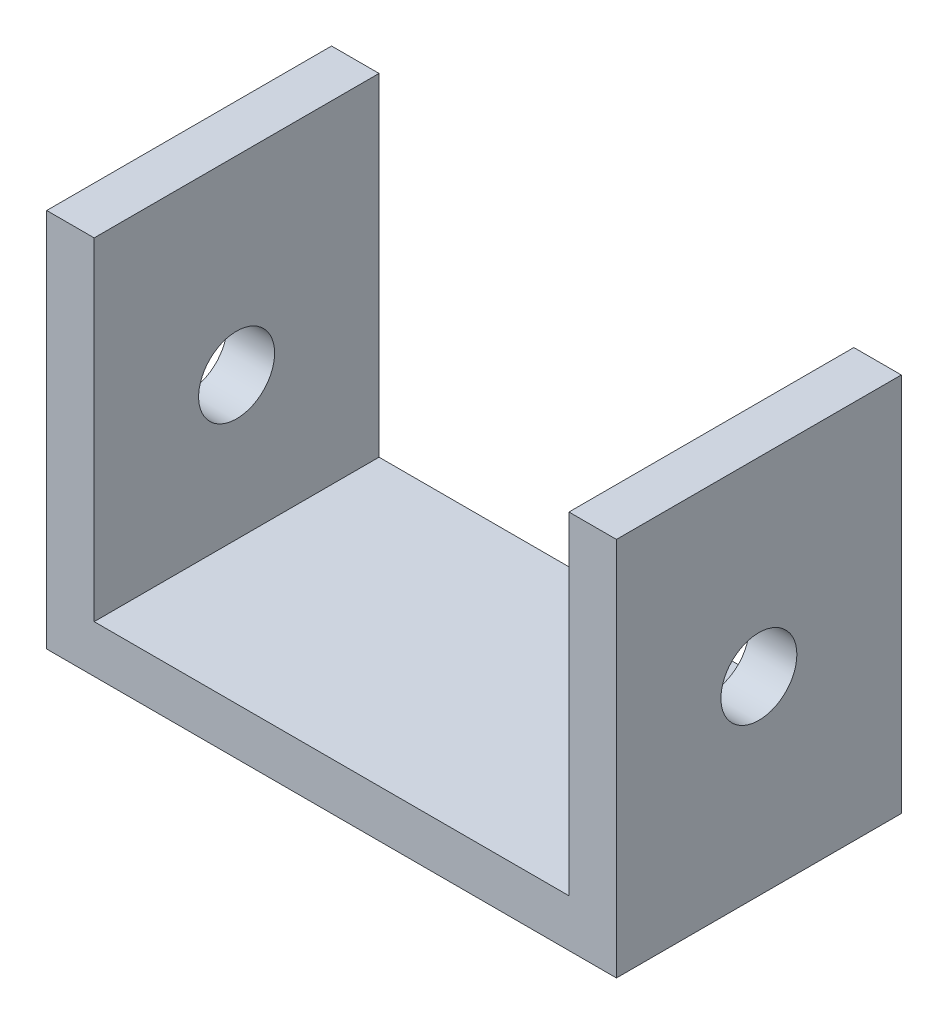
ISO-10303-21;
HEADER;
FILE_DESCRIPTION(('STEP AP214'),'2;1');
FILE_NAME('part.step','',(''),(''),'','','');
FILE_SCHEMA(('AUTOMOTIVE_DESIGN { 1 0 10303 214 1 1 1 1 }'));
ENDSEC;
DATA;
#1=APPLICATION_CONTEXT('core data for automotive mechanical design processes');
#2=APPLICATION_PROTOCOL_DEFINITION('international standard','automotive_design',2000,#1);
#3=PRODUCT_CONTEXT('',#1,'mechanical');
#4=PRODUCT('Part','Part','',(#3));
#5=PRODUCT_RELATED_PRODUCT_CATEGORY('part','',(#4));
#6=PRODUCT_DEFINITION_FORMATION('','',#4);
#7=PRODUCT_DEFINITION_CONTEXT('part definition',#1,'design');
#8=PRODUCT_DEFINITION('design','',#6,#7);
#9=PRODUCT_DEFINITION_SHAPE('','',#8);
#10=(LENGTH_UNIT() NAMED_UNIT(*) SI_UNIT(.MILLI.,.METRE.));
#11=(NAMED_UNIT(*) PLANE_ANGLE_UNIT() SI_UNIT($,.RADIAN.));
#12=(NAMED_UNIT(*) SI_UNIT($,.STERADIAN.) SOLID_ANGLE_UNIT());
#13=UNCERTAINTY_MEASURE_WITH_UNIT(LENGTH_MEASURE(1.E-05),#10,'distance_accuracy_value','');
#14=(GEOMETRIC_REPRESENTATION_CONTEXT(3) GLOBAL_UNCERTAINTY_ASSIGNED_CONTEXT((#13)) GLOBAL_UNIT_ASSIGNED_CONTEXT((#10,
#11,#12)) REPRESENTATION_CONTEXT('',''));
#15=CARTESIAN_POINT('',(0.,0.,0.));
#16=DIRECTION('',(0.,0.,1.));
#17=DIRECTION('',(1.,0.,0.));
#18=AXIS2_PLACEMENT_3D('',#15,#16,#17);
#19=CARTESIAN_POINT('',(0.,10.,0.));
#20=DIRECTION('',(0.,1.,0.));
#21=DIRECTION('',(0.,0.,1.));
#22=AXIS2_PLACEMENT_3D('',#19,#20,#21);
#23=PLANE('',#22);
#24=DIRECTION('',(-1.,0.,0.));
#25=VECTOR('',#24,1.);
#26=CARTESIAN_POINT('',(-60.,10.,-30.));
#27=LINE('',#26,#25);
#28=CARTESIAN_POINT('',(50.,10.,-30.));
#29=VERTEX_POINT('',#28);
#30=CARTESIAN_POINT('',(-50.,10.,-30.));
#31=VERTEX_POINT('',#30);
#32=EDGE_CURVE('E167',#29,#31,#27,.T.);
#33=ORIENTED_EDGE('',*,*,#32,.T.);
#34=DIRECTION('',(0.,0.,1.));
#35=VECTOR('',#34,1.);
#36=CARTESIAN_POINT('',(-50.,10.,30.));
#37=LINE('',#36,#35);
#38=CARTESIAN_POINT('',(-50.,10.,30.));
#39=VERTEX_POINT('',#38);
#40=EDGE_CURVE('E128',#31,#39,#37,.T.);
#41=ORIENTED_EDGE('',*,*,#40,.T.);
#42=DIRECTION('',(1.,0.,0.));
#43=VECTOR('',#42,1.);
#44=CARTESIAN_POINT('',(-60.,10.,30.));
#45=LINE('',#44,#43);
#46=CARTESIAN_POINT('',(50.,10.,30.));
#47=VERTEX_POINT('',#46);
#48=EDGE_CURVE('E169',#39,#47,#45,.T.);
#49=ORIENTED_EDGE('',*,*,#48,.T.);
#50=DIRECTION('',(0.,0.,1.));
#51=VECTOR('',#50,1.);
#52=CARTESIAN_POINT('',(50.,10.,30.));
#53=LINE('',#52,#51);
#54=EDGE_CURVE('E62',#29,#47,#53,.T.);
#55=ORIENTED_EDGE('',*,*,#54,.F.);
#56=EDGE_LOOP('',(#33,#41,#49,#55));
#57=FACE_BOUND('',#56,.T.);
#58=ADVANCED_FACE('F41',(#57),#23,.T.);
#59=CARTESIAN_POINT('',(60.,10.,-30.));
#60=DIRECTION('',(-1.,0.,0.));
#61=DIRECTION('',(0.,0.,1.));
#62=AXIS2_PLACEMENT_3D('',#59,#60,#61);
#63=PLANE('',#62);
#64=CARTESIAN_POINT('',(60.,40.,0.));
#65=DIRECTION('',(1.,0.,0.));
#66=DIRECTION('',(0.,0.,-1.));
#67=AXIS2_PLACEMENT_3D('',#64,#65,#66);
#68=CIRCLE('',#67,8.);
#69=CARTESIAN_POINT('',(60.,40.,-8.00000000000001));
#70=VERTEX_POINT('',#69);
#71=EDGE_CURVE('E141',#70,#70,#68,.T.);
#72=ORIENTED_EDGE('',*,*,#71,.F.);
#73=EDGE_LOOP('',(#72));
#74=FACE_BOUND('',#73,.T.);
#75=DIRECTION('',(0.,-1.,0.));
#76=VECTOR('',#75,1.);
#77=CARTESIAN_POINT('',(60.,10.,30.));
#78=LINE('',#77,#76);
#79=CARTESIAN_POINT('',(60.,80.,30.));
#80=VERTEX_POINT('',#79);
#81=CARTESIAN_POINT('',(60.,0.,30.));
#82=VERTEX_POINT('',#81);
#83=EDGE_CURVE('E173',#80,#82,#78,.T.);
#84=ORIENTED_EDGE('',*,*,#83,.T.);
#85=DIRECTION('',(0.,0.,-1.));
#86=VECTOR('',#85,1.);
#87=CARTESIAN_POINT('',(60.,0.,-30.));
#88=LINE('',#87,#86);
#89=CARTESIAN_POINT('',(60.,0.,-30.));
#90=VERTEX_POINT('',#89);
#91=EDGE_CURVE('E164',#82,#90,#88,.T.);
#92=ORIENTED_EDGE('',*,*,#91,.T.);
#93=DIRECTION('',(0.,-1.,0.));
#94=VECTOR('',#93,1.);
#95=CARTESIAN_POINT('',(60.,10.,-30.));
#96=LINE('',#95,#94);
#97=CARTESIAN_POINT('',(60.,80.,-30.));
#98=VERTEX_POINT('',#97);
#99=EDGE_CURVE('E11',#98,#90,#96,.T.);
#100=ORIENTED_EDGE('',*,*,#99,.F.);
#101=DIRECTION('',(0.,0.,-1.));
#102=VECTOR('',#101,1.);
#103=CARTESIAN_POINT('',(60.,80.,30.));
#104=LINE('',#103,#102);
#105=EDGE_CURVE('E146',#80,#98,#104,.T.);
#106=ORIENTED_EDGE('',*,*,#105,.F.);
#107=EDGE_LOOP('',(#84,#92,#100,#106));
#108=FACE_BOUND('',#107,.T.);
#109=ADVANCED_FACE('F43',(#74,#108),#63,.F.);
#110=CARTESIAN_POINT('',(-60.,10.,-30.));
#111=DIRECTION('',(0.,0.,1.));
#112=DIRECTION('',(1.,0.,0.));
#113=AXIS2_PLACEMENT_3D('',#110,#111,#112);
#114=PLANE('',#113);
#115=ORIENTED_EDGE('',*,*,#99,.T.);
#116=DIRECTION('',(-1.,0.,0.));
#117=VECTOR('',#116,1.);
#118=CARTESIAN_POINT('',(-60.,0.,-30.));
#119=LINE('',#118,#117);
#120=CARTESIAN_POINT('',(-60.,0.,-30.));
#121=VERTEX_POINT('',#120);
#122=EDGE_CURVE('E115',#90,#121,#119,.T.);
#123=ORIENTED_EDGE('',*,*,#122,.T.);
#124=DIRECTION('',(0.,-1.,0.));
#125=VECTOR('',#124,1.);
#126=CARTESIAN_POINT('',(-60.,10.,-30.));
#127=LINE('',#126,#125);
#128=CARTESIAN_POINT('',(-60.,80.,-30.));
#129=VERTEX_POINT('',#128);
#130=EDGE_CURVE('E49',#129,#121,#127,.T.);
#131=ORIENTED_EDGE('',*,*,#130,.F.);
#132=DIRECTION('',(1.,0.,0.));
#133=VECTOR('',#132,1.);
#134=CARTESIAN_POINT('',(-50.,80.,-30.));
#135=LINE('',#134,#133);
#136=CARTESIAN_POINT('',(-50.,80.,-30.));
#137=VERTEX_POINT('',#136);
#138=EDGE_CURVE('E109',#129,#137,#135,.T.);
#139=ORIENTED_EDGE('',*,*,#138,.T.);
#140=DIRECTION('',(0.,-1.,0.));
#141=VECTOR('',#140,1.);
#142=CARTESIAN_POINT('',(-50.,80.,-30.));
#143=LINE('',#142,#141);
#144=EDGE_CURVE('E143',#137,#31,#143,.T.);
#145=ORIENTED_EDGE('',*,*,#144,.T.);
#146=ORIENTED_EDGE('',*,*,#32,.F.);
#147=DIRECTION('',(0.,-1.,0.));
#148=VECTOR('',#147,1.);
#149=CARTESIAN_POINT('',(50.,80.,-30.));
#150=LINE('',#149,#148);
#151=CARTESIAN_POINT('',(50.,80.,-30.));
#152=VERTEX_POINT('',#151);
#153=EDGE_CURVE('E165',#152,#29,#150,.T.);
#154=ORIENTED_EDGE('',*,*,#153,.F.);
#155=DIRECTION('',(-1.,0.,0.));
#156=VECTOR('',#155,1.);
#157=CARTESIAN_POINT('',(50.,80.,-30.));
#158=LINE('',#157,#156);
#159=EDGE_CURVE('E151',#98,#152,#158,.T.);
#160=ORIENTED_EDGE('',*,*,#159,.F.);
#161=EDGE_LOOP('',(#115,#123,#131,#139,#145,#146,#154,#160));
#162=FACE_BOUND('',#161,.T.);
#163=ADVANCED_FACE('F107',(#162),#114,.F.);
#164=CARTESIAN_POINT('',(-60.,10.,-30.));
#165=DIRECTION('',(1.,0.,0.));
#166=DIRECTION('',(0.,0.,-1.));
#167=AXIS2_PLACEMENT_3D('',#164,#165,#166);
#168=PLANE('',#167);
#169=DIRECTION('',(0.,0.,1.));
#170=VECTOR('',#169,1.);
#171=CARTESIAN_POINT('',(-60.,0.,-30.));
#172=LINE('',#171,#170);
#173=CARTESIAN_POINT('',(-60.,0.,30.));
#174=VERTEX_POINT('',#173);
#175=EDGE_CURVE('E172',#121,#174,#172,.T.);
#176=ORIENTED_EDGE('',*,*,#175,.T.);
#177=DIRECTION('',(0.,-1.,0.));
#178=VECTOR('',#177,1.);
#179=CARTESIAN_POINT('',(-60.,10.,30.));
#180=LINE('',#179,#178);
#181=CARTESIAN_POINT('',(-60.,80.,30.));
#182=VERTEX_POINT('',#181);
#183=EDGE_CURVE('E118',#182,#174,#180,.T.);
#184=ORIENTED_EDGE('',*,*,#183,.F.);
#185=DIRECTION('',(0.,0.,-1.));
#186=VECTOR('',#185,1.);
#187=CARTESIAN_POINT('',(-60.,80.,30.));
#188=LINE('',#187,#186);
#189=EDGE_CURVE('E125',#182,#129,#188,.T.);
#190=ORIENTED_EDGE('',*,*,#189,.T.);
#191=ORIENTED_EDGE('',*,*,#130,.T.);
#192=EDGE_LOOP('',(#176,#184,#190,#191));
#193=FACE_BOUND('',#192,.T.);
#194=CARTESIAN_POINT('',(-60.,40.,0.));
#195=DIRECTION('',(1.,0.,0.));
#196=DIRECTION('',(0.,0.,-1.));
#197=AXIS2_PLACEMENT_3D('',#194,#195,#196);
#198=CIRCLE('',#197,8.);
#199=CARTESIAN_POINT('',(-60.,40.,-8.00000000000001));
#200=VERTEX_POINT('',#199);
#201=EDGE_CURVE('E132',#200,#200,#198,.T.);
#202=ORIENTED_EDGE('',*,*,#201,.T.);
#203=EDGE_LOOP('',(#202));
#204=FACE_BOUND('',#203,.T.);
#205=ADVANCED_FACE('F127',(#193,#204),#168,.F.);
#206=CARTESIAN_POINT('',(-60.,10.,30.));
#207=DIRECTION('',(0.,0.,-1.));
#208=DIRECTION('',(-1.,0.,0.));
#209=AXIS2_PLACEMENT_3D('',#206,#207,#208);
#210=PLANE('',#209);
#211=DIRECTION('',(0.,-1.,0.));
#212=VECTOR('',#211,1.);
#213=CARTESIAN_POINT('',(50.,80.,30.));
#214=LINE('',#213,#212);
#215=CARTESIAN_POINT('',(50.,80.,30.));
#216=VERTEX_POINT('',#215);
#217=EDGE_CURVE('E158',#216,#47,#214,.T.);
#218=ORIENTED_EDGE('',*,*,#217,.T.);
#219=ORIENTED_EDGE('',*,*,#48,.F.);
#220=DIRECTION('',(0.,-1.,0.));
#221=VECTOR('',#220,1.);
#222=CARTESIAN_POINT('',(-50.,80.,30.));
#223=LINE('',#222,#221);
#224=CARTESIAN_POINT('',(-50.,80.,30.));
#225=VERTEX_POINT('',#224);
#226=EDGE_CURVE('E60',#225,#39,#223,.T.);
#227=ORIENTED_EDGE('',*,*,#226,.F.);
#228=DIRECTION('',(-1.,0.,0.));
#229=VECTOR('',#228,1.);
#230=CARTESIAN_POINT('',(-50.,80.,30.));
#231=LINE('',#230,#229);
#232=EDGE_CURVE('E136',#225,#182,#231,.T.);
#233=ORIENTED_EDGE('',*,*,#232,.T.);
#234=ORIENTED_EDGE('',*,*,#183,.T.);
#235=DIRECTION('',(1.,0.,0.));
#236=VECTOR('',#235,1.);
#237=CARTESIAN_POINT('',(-60.,0.,30.));
#238=LINE('',#237,#236);
#239=EDGE_CURVE('E166',#174,#82,#238,.T.);
#240=ORIENTED_EDGE('',*,*,#239,.T.);
#241=ORIENTED_EDGE('',*,*,#83,.F.);
#242=DIRECTION('',(1.,0.,0.));
#243=VECTOR('',#242,1.);
#244=CARTESIAN_POINT('',(50.,80.,30.));
#245=LINE('',#244,#243);
#246=EDGE_CURVE('E154',#216,#80,#245,.T.);
#247=ORIENTED_EDGE('',*,*,#246,.F.);
#248=EDGE_LOOP('',(#218,#219,#227,#233,#234,#240,#241,#247));
#249=FACE_BOUND('',#248,.T.);
#250=ADVANCED_FACE('F185',(#249),#210,.F.);
#251=CARTESIAN_POINT('',(0.,0.,0.));
#252=DIRECTION('',(0.,1.,0.));
#253=DIRECTION('',(0.,0.,1.));
#254=AXIS2_PLACEMENT_3D('',#251,#252,#253);
#255=PLANE('',#254);
#256=ORIENTED_EDGE('',*,*,#91,.F.);
#257=ORIENTED_EDGE('',*,*,#239,.F.);
#258=ORIENTED_EDGE('',*,*,#175,.F.);
#259=ORIENTED_EDGE('',*,*,#122,.F.);
#260=EDGE_LOOP('',(#256,#257,#258,#259));
#261=FACE_BOUND('',#260,.T.);
#262=ADVANCED_FACE('F183',(#261),#255,.F.);
#263=CARTESIAN_POINT('',(50.,80.,30.));
#264=DIRECTION('',(1.,0.,0.));
#265=DIRECTION('',(0.,0.,-1.));
#266=AXIS2_PLACEMENT_3D('',#263,#264,#265);
#267=PLANE('',#266);
#268=CARTESIAN_POINT('',(50.,40.,0.));
#269=DIRECTION('',(1.,0.,0.));
#270=DIRECTION('',(0.,0.,-1.));
#271=AXIS2_PLACEMENT_3D('',#268,#269,#270);
#272=CIRCLE('',#271,8.);
#273=CARTESIAN_POINT('',(50.,40.,-8.00000000000001));
#274=VERTEX_POINT('',#273);
#275=EDGE_CURVE('E44',#274,#274,#272,.T.);
#276=ORIENTED_EDGE('',*,*,#275,.T.);
#277=EDGE_LOOP('',(#276));
#278=FACE_BOUND('',#277,.T.);
#279=ORIENTED_EDGE('',*,*,#54,.T.);
#280=ORIENTED_EDGE('',*,*,#217,.F.);
#281=DIRECTION('',(0.,0.,1.));
#282=VECTOR('',#281,1.);
#283=CARTESIAN_POINT('',(50.,80.,30.));
#284=LINE('',#283,#282);
#285=EDGE_CURVE('E153',#152,#216,#284,.T.);
#286=ORIENTED_EDGE('',*,*,#285,.F.);
#287=ORIENTED_EDGE('',*,*,#153,.T.);
#288=EDGE_LOOP('',(#279,#280,#286,#287));
#289=FACE_BOUND('',#288,.T.);
#290=ADVANCED_FACE('F198',(#278,#289),#267,.F.);
#291=CARTESIAN_POINT('',(0.,80.,0.));
#292=DIRECTION('',(0.,-1.,0.));
#293=DIRECTION('',(0.,0.,-1.));
#294=AXIS2_PLACEMENT_3D('',#291,#292,#293);
#295=PLANE('',#294);
#296=ORIENTED_EDGE('',*,*,#105,.T.);
#297=ORIENTED_EDGE('',*,*,#159,.T.);
#298=ORIENTED_EDGE('',*,*,#285,.T.);
#299=ORIENTED_EDGE('',*,*,#246,.T.);
#300=EDGE_LOOP('',(#296,#297,#298,#299));
#301=FACE_BOUND('',#300,.T.);
#302=ADVANCED_FACE('F193',(#301),#295,.F.);
#303=CARTESIAN_POINT('',(10.,40.,0.));
#304=DIRECTION('',(1.,0.,0.));
#305=DIRECTION('',(0.,0.,-1.));
#306=AXIS2_PLACEMENT_3D('',#303,#304,#305);
#307=CYLINDRICAL_SURFACE('',#306,8.);
#308=ORIENTED_EDGE('',*,*,#71,.T.);
#309=EDGE_LOOP('',(#308));
#310=FACE_BOUND('',#309,.T.);
#311=ORIENTED_EDGE('',*,*,#275,.F.);
#312=EDGE_LOOP('',(#311));
#313=FACE_BOUND('',#312,.T.);
#314=ADVANCED_FACE('F199',(#310,#313),#307,.F.);
#315=CARTESIAN_POINT('',(-50.,80.,30.));
#316=DIRECTION('',(-1.,0.,0.));
#317=DIRECTION('',(0.,0.,-1.));
#318=AXIS2_PLACEMENT_3D('',#315,#316,#317);
#319=PLANE('',#318);
#320=CARTESIAN_POINT('',(-50.,40.,0.));
#321=DIRECTION('',(1.,0.,0.));
#322=DIRECTION('',(0.,0.,-1.));
#323=AXIS2_PLACEMENT_3D('',#320,#321,#322);
#324=CIRCLE('',#323,8.);
#325=CARTESIAN_POINT('',(-50.,40.,-8.00000000000001));
#326=VERTEX_POINT('',#325);
#327=EDGE_CURVE('E135',#326,#326,#324,.T.);
#328=ORIENTED_EDGE('',*,*,#327,.F.);
#329=EDGE_LOOP('',(#328));
#330=FACE_BOUND('',#329,.T.);
#331=ORIENTED_EDGE('',*,*,#40,.F.);
#332=ORIENTED_EDGE('',*,*,#144,.F.);
#333=DIRECTION('',(0.,0.,1.));
#334=VECTOR('',#333,1.);
#335=CARTESIAN_POINT('',(-50.,80.,30.));
#336=LINE('',#335,#334);
#337=EDGE_CURVE('E121',#137,#225,#336,.T.);
#338=ORIENTED_EDGE('',*,*,#337,.T.);
#339=ORIENTED_EDGE('',*,*,#226,.T.);
#340=EDGE_LOOP('',(#331,#332,#338,#339));
#341=FACE_BOUND('',#340,.T.);
#342=ADVANCED_FACE('F196',(#330,#341),#319,.F.);
#343=CARTESIAN_POINT('',(0.,80.,0.));
#344=DIRECTION('',(0.,-1.,0.));
#345=DIRECTION('',(0.,0.,-1.));
#346=AXIS2_PLACEMENT_3D('',#343,#344,#345);
#347=PLANE('',#346);
#348=ORIENTED_EDGE('',*,*,#189,.F.);
#349=ORIENTED_EDGE('',*,*,#232,.F.);
#350=ORIENTED_EDGE('',*,*,#337,.F.);
#351=ORIENTED_EDGE('',*,*,#138,.F.);
#352=EDGE_LOOP('',(#348,#349,#350,#351));
#353=FACE_BOUND('',#352,.T.);
#354=ADVANCED_FACE('F117',(#353),#347,.F.);
#355=CARTESIAN_POINT('',(-10.,40.,0.));
#356=DIRECTION('',(-1.,0.,0.));
#357=DIRECTION('',(0.,0.,-1.));
#358=AXIS2_PLACEMENT_3D('',#355,#356,#357);
#359=CYLINDRICAL_SURFACE('',#358,8.);
#360=ORIENTED_EDGE('',*,*,#201,.F.);
#361=EDGE_LOOP('',(#360));
#362=FACE_BOUND('',#361,.T.);
#363=ORIENTED_EDGE('',*,*,#327,.T.);
#364=EDGE_LOOP('',(#363));
#365=FACE_BOUND('',#364,.T.);
#366=ADVANCED_FACE('F210',(#362,#365),#359,.F.);
#367=CLOSED_SHELL('',(#58,#109,#163,#205,#250,#262,#290,#302,#314,#342,#354,#366));
#368=MANIFOLD_SOLID_BREP('B2',#367);
#369=ADVANCED_BREP_SHAPE_REPRESENTATION('',(#18,#368),#14);
#370=SHAPE_DEFINITION_REPRESENTATION(#9,#369);
ENDSEC;
END-ISO-10303-21;
